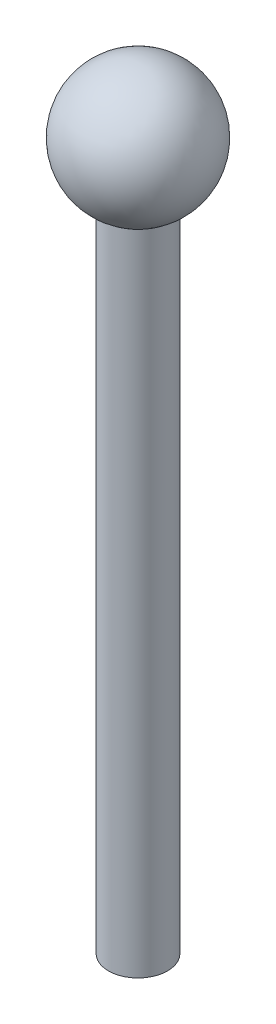
ISO-10303-21;
HEADER;
FILE_DESCRIPTION(('STEP AP214'),'2;1');
FILE_NAME('part.step','',(''),(''),'','','');
FILE_SCHEMA(('AUTOMOTIVE_DESIGN { 1 0 10303 214 1 1 1 1 }'));
ENDSEC;
DATA;
#1=APPLICATION_CONTEXT('core data for automotive mechanical design processes');
#2=APPLICATION_PROTOCOL_DEFINITION('international standard','automotive_design',2000,#1);
#3=PRODUCT_CONTEXT('',#1,'mechanical');
#4=PRODUCT('Part','Part','',(#3));
#5=PRODUCT_RELATED_PRODUCT_CATEGORY('part','',(#4));
#6=PRODUCT_DEFINITION_FORMATION('','',#4);
#7=PRODUCT_DEFINITION_CONTEXT('part definition',#1,'design');
#8=PRODUCT_DEFINITION('design','',#6,#7);
#9=PRODUCT_DEFINITION_SHAPE('','',#8);
#10=(LENGTH_UNIT() NAMED_UNIT(*) SI_UNIT(.MILLI.,.METRE.));
#11=(NAMED_UNIT(*) PLANE_ANGLE_UNIT() SI_UNIT($,.RADIAN.));
#12=(NAMED_UNIT(*) SI_UNIT($,.STERADIAN.) SOLID_ANGLE_UNIT());
#13=UNCERTAINTY_MEASURE_WITH_UNIT(LENGTH_MEASURE(1.E-05),#10,'distance_accuracy_value','');
#14=(GEOMETRIC_REPRESENTATION_CONTEXT(3) GLOBAL_UNCERTAINTY_ASSIGNED_CONTEXT((#13)) GLOBAL_UNIT_ASSIGNED_CONTEXT((#10,
#11,#12)) REPRESENTATION_CONTEXT('',''));
#15=CARTESIAN_POINT('',(0.,0.,0.));
#16=DIRECTION('',(0.,0.,1.));
#17=DIRECTION('',(1.,0.,0.));
#18=AXIS2_PLACEMENT_3D('',#15,#16,#17);
#19=CARTESIAN_POINT('',(0.,0.,0.));
#20=DIRECTION('',(0.,1.,0.));
#21=DIRECTION('',(-1.,0.,0.));
#22=AXIS2_PLACEMENT_3D('',#19,#20,#21);
#23=PLANE('',#22);
#24=CARTESIAN_POINT('',(0.,0.,0.));
#25=DIRECTION('',(0.,-1.,0.));
#26=DIRECTION('',(1.,0.,0.));
#27=AXIS2_PLACEMENT_3D('',#24,#25,#26);
#28=CIRCLE('',#27,4.55653977343636);
#29=CARTESIAN_POINT('',(4.55653977343636,0.,0.));
#30=VERTEX_POINT('',#29);
#31=EDGE_CURVE('E10',#30,#30,#28,.T.);
#32=ORIENTED_EDGE('',*,*,#31,.T.);
#33=EDGE_LOOP('',(#32));
#34=FACE_BOUND('',#33,.T.);
#35=ADVANCED_FACE('F31',(#34),#23,.F.);
#36=CARTESIAN_POINT('',(0.,0.,0.));
#37=DIRECTION('',(0.,-1.,0.));
#38=DIRECTION('',(1.,0.,0.));
#39=AXIS2_PLACEMENT_3D('',#36,#37,#38);
#40=CYLINDRICAL_SURFACE('',#39,4.55653977343636);
#41=ORIENTED_EDGE('',*,*,#31,.F.);
#42=EDGE_LOOP('',(#41));
#43=FACE_BOUND('',#42,.T.);
#44=CARTESIAN_POINT('',(0.,100.,0.));
#45=DIRECTION('',(0.,-1.,0.));
#46=DIRECTION('',(1.,0.,0.));
#47=AXIS2_PLACEMENT_3D('',#44,#45,#46);
#48=CIRCLE('',#47,4.55653977343636);
#49=CARTESIAN_POINT('',(4.55653977343636,100.,0.));
#50=VERTEX_POINT('',#49);
#51=EDGE_CURVE('E37',#50,#50,#48,.T.);
#52=ORIENTED_EDGE('',*,*,#51,.T.);
#53=EDGE_LOOP('',(#52));
#54=FACE_BOUND('',#53,.T.);
#55=ADVANCED_FACE('F43',(#43,#54),#40,.T.);
#56=CARTESIAN_POINT('',(0.,108.90156982184,0.));
#57=DIRECTION('',(0.,-1.,0.));
#58=DIRECTION('',(-1.,0.,0.));
#59=AXIS2_PLACEMENT_3D('',#56,#57,#58);
#60=SPHERICAL_SURFACE('',#59,10.);
#61=ORIENTED_EDGE('',*,*,#51,.F.);
#62=EDGE_LOOP('',(#61));
#63=FACE_BOUND('',#62,.T.);
#64=ADVANCED_FACE('F45',(#63),#60,.T.);
#65=CLOSED_SHELL('',(#35,#55,#64));
#66=MANIFOLD_SOLID_BREP('B2',#65);
#67=ADVANCED_BREP_SHAPE_REPRESENTATION('',(#18,#66),#14);
#68=SHAPE_DEFINITION_REPRESENTATION(#9,#67);
ENDSEC;
END-ISO-10303-21;
